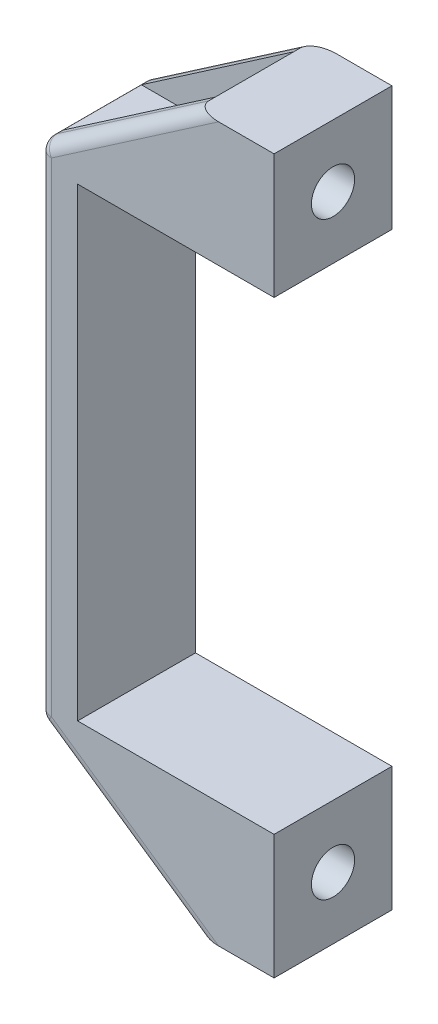
ISO-10303-21;
HEADER;
FILE_DESCRIPTION(('STEP AP214'),'2;1');
FILE_NAME('part.step','',(''),(''),'','','');
FILE_SCHEMA(('AUTOMOTIVE_DESIGN { 1 0 10303 214 1 1 1 1 }'));
ENDSEC;
DATA;
#1=APPLICATION_CONTEXT('core data for automotive mechanical design processes');
#2=APPLICATION_PROTOCOL_DEFINITION('international standard','automotive_design',2000,#1);
#3=PRODUCT_CONTEXT('',#1,'mechanical');
#4=PRODUCT('Part','Part','',(#3));
#5=PRODUCT_RELATED_PRODUCT_CATEGORY('part','',(#4));
#6=PRODUCT_DEFINITION_FORMATION('','',#4);
#7=PRODUCT_DEFINITION_CONTEXT('part definition',#1,'design');
#8=PRODUCT_DEFINITION('design','',#6,#7);
#9=PRODUCT_DEFINITION_SHAPE('','',#8);
#10=(LENGTH_UNIT() NAMED_UNIT(*) SI_UNIT(.MILLI.,.METRE.));
#11=(NAMED_UNIT(*) PLANE_ANGLE_UNIT() SI_UNIT($,.RADIAN.));
#12=(NAMED_UNIT(*) SI_UNIT($,.STERADIAN.) SOLID_ANGLE_UNIT());
#13=UNCERTAINTY_MEASURE_WITH_UNIT(LENGTH_MEASURE(1.E-05),#10,'distance_accuracy_value','');
#14=(GEOMETRIC_REPRESENTATION_CONTEXT(3) GLOBAL_UNCERTAINTY_ASSIGNED_CONTEXT((#13)) GLOBAL_UNIT_ASSIGNED_CONTEXT((#10,
#11,#12)) REPRESENTATION_CONTEXT('',''));
#15=CARTESIAN_POINT('',(0.,0.,0.));
#16=DIRECTION('',(0.,0.,1.));
#17=DIRECTION('',(1.,0.,0.));
#18=AXIS2_PLACEMENT_3D('',#15,#16,#17);
#19=CARTESIAN_POINT('',(-12.,0.,9.));
#20=DIRECTION('',(0.566528822887066,0.824041924199367,0.));
#21=DIRECTION('',(-0.824041924199367,0.566528822887066,0.));
#22=AXIS2_PLACEMENT_3D('',#19,#20,#21);
#23=PLANE('',#22);
#24=DIRECTION('',(0.824041924199367,-0.566528822887066,0.));
#25=VECTOR('',#24,1.);
#26=CARTESIAN_POINT('',(-12.,0.,7.));
#27=LINE('',#26,#25);
#28=CARTESIAN_POINT('',(-12.,0.,7.));
#29=VERTEX_POINT('',#28);
#30=CARTESIAN_POINT('',(-35.1330576457741,15.9039771314697,7.));
#31=VERTEX_POINT('',#30);
#32=EDGE_CURVE('E278',#29,#31,#27,.F.);
#33=ORIENTED_EDGE('',*,*,#32,.T.);
#34=DIRECTION('',(0.,0.,-1.));
#35=VECTOR('',#34,1.);
#36=CARTESIAN_POINT('',(-35.1330576457741,15.9039771314697,9.));
#37=LINE('',#36,#35);
#38=CARTESIAN_POINT('',(-35.1330576457741,15.9039771314697,6.));
#39=VERTEX_POINT('',#38);
#40=EDGE_CURVE('E225',#31,#39,#37,.T.);
#41=ORIENTED_EDGE('',*,*,#40,.T.);
#42=DIRECTION('',(-0.824041924199367,0.566528822887066,0.));
#43=VECTOR('',#42,1.);
#44=CARTESIAN_POINT('',(-12.,0.,6.));
#45=LINE('',#44,#43);
#46=CARTESIAN_POINT('',(-12.,0.,6.));
#47=VERTEX_POINT('',#46);
#48=EDGE_CURVE('E213',#47,#39,#45,.T.);
#49=ORIENTED_EDGE('',*,*,#48,.F.);
#50=DIRECTION('',(0.,0.,-1.));
#51=VECTOR('',#50,1.);
#52=CARTESIAN_POINT('',(-12.,0.,9.));
#53=LINE('',#52,#51);
#54=EDGE_CURVE('E196',#29,#47,#53,.T.);
#55=ORIENTED_EDGE('',*,*,#54,.F.);
#56=EDGE_LOOP('',(#33,#41,#49,#55));
#57=FACE_BOUND('',#56,.T.);
#58=ADVANCED_FACE('F31',(#57),#23,.F.);
#59=CARTESIAN_POINT('',(-36.,92.5,9.));
#60=DIRECTION('',(0.566528822887066,-0.824041924199367,0.));
#61=DIRECTION('',(0.824041924199367,0.566528822887066,0.));
#62=AXIS2_PLACEMENT_3D('',#59,#60,#61);
#63=PLANE('',#62);
#64=DIRECTION('',(0.,0.,-1.));
#65=VECTOR('',#64,1.);
#66=CARTESIAN_POINT('',(-12.,109.,9.));
#67=LINE('',#66,#65);
#68=CARTESIAN_POINT('',(-12.,109.,-6.));
#69=VERTEX_POINT('',#68);
#70=CARTESIAN_POINT('',(-12.,109.,-7.));
#71=VERTEX_POINT('',#70);
#72=EDGE_CURVE('E207',#69,#71,#67,.T.);
#73=ORIENTED_EDGE('',*,*,#72,.T.);
#74=DIRECTION('',(-0.824041924199367,-0.566528822887066,0.));
#75=VECTOR('',#74,1.);
#76=CARTESIAN_POINT('',(-36.,92.5,-7.));
#77=LINE('',#76,#75);
#78=CARTESIAN_POINT('',(-35.1330576457741,93.0960228685303,-7.));
#79=VERTEX_POINT('',#78);
#80=EDGE_CURVE('E240',#71,#79,#77,.T.);
#81=ORIENTED_EDGE('',*,*,#80,.T.);
#82=DIRECTION('',(0.,0.,-1.));
#83=VECTOR('',#82,1.);
#84=CARTESIAN_POINT('',(-35.1330576457741,93.0960228685303,9.));
#85=LINE('',#84,#83);
#86=CARTESIAN_POINT('',(-35.1330576457741,93.0960228685303,-6.));
#87=VERTEX_POINT('',#86);
#88=EDGE_CURVE('E238',#79,#87,#85,.F.);
#89=ORIENTED_EDGE('',*,*,#88,.T.);
#90=DIRECTION('',(0.824041924199367,0.566528822887066,0.));
#91=VECTOR('',#90,1.);
#92=CARTESIAN_POINT('',(-36.,92.5,-6.));
#93=LINE('',#92,#91);
#94=EDGE_CURVE('E227',#87,#69,#93,.T.);
#95=ORIENTED_EDGE('',*,*,#94,.T.);
#96=EDGE_LOOP('',(#73,#81,#89,#95));
#97=FACE_BOUND('',#96,.T.);
#98=ADVANCED_FACE('F467',(#97),#63,.F.);
#99=DIRECTION('',(0.824041924199367,-0.566528822887066,0.));
#100=VECTOR('',#99,1.);
#101=CARTESIAN_POINT('',(-12.,0.,-6.));
#102=LINE('',#101,#100);
#103=CARTESIAN_POINT('',(-35.1330576457741,15.9039771314697,-6.));
#104=VERTEX_POINT('',#103);
#105=CARTESIAN_POINT('',(-12.,0.,-6.));
#106=VERTEX_POINT('',#105);
#107=EDGE_CURVE('E226',#104,#106,#102,.T.);
#108=ORIENTED_EDGE('',*,*,#107,.F.);
#109=DIRECTION('',(0.,0.,-1.));
#110=VECTOR('',#109,1.);
#111=CARTESIAN_POINT('',(-35.1330576457741,15.9039771314697,9.));
#112=LINE('',#111,#110);
#113=CARTESIAN_POINT('',(-35.1330576457741,15.9039771314697,-7.));
#114=VERTEX_POINT('',#113);
#115=EDGE_CURVE('E276',#104,#114,#112,.T.);
#116=ORIENTED_EDGE('',*,*,#115,.T.);
#117=DIRECTION('',(0.824041924199367,-0.566528822887066,0.));
#118=VECTOR('',#117,1.);
#119=CARTESIAN_POINT('',(-12.,0.,-7.));
#120=LINE('',#119,#118);
#121=CARTESIAN_POINT('',(-12.,0.,-7.));
#122=VERTEX_POINT('',#121);
#123=EDGE_CURVE('E274',#114,#122,#120,.T.);
#124=ORIENTED_EDGE('',*,*,#123,.T.);
#125=EDGE_CURVE('E208',#106,#122,#53,.T.);
#126=ORIENTED_EDGE('',*,*,#125,.F.);
#127=EDGE_LOOP('',(#108,#116,#124,#126));
#128=FACE_BOUND('',#127,.T.);
#129=ADVANCED_FACE('F500',(#128),#23,.F.);
#130=CARTESIAN_POINT('',(0.,19.,9.));
#131=DIRECTION('',(-1.,0.,0.));
#132=DIRECTION('',(0.,-1.,0.));
#133=AXIS2_PLACEMENT_3D('',#130,#131,#132);
#134=PLANE('',#133);
#135=CARTESIAN_POINT('',(0.,9.49999999999999,0.));
#136=DIRECTION('',(-1.,0.,0.));
#137=DIRECTION('',(0.,0.,1.));
#138=AXIS2_PLACEMENT_3D('',#135,#136,#137);
#139=CIRCLE('',#138,3.3);
#140=CARTESIAN_POINT('',(0.,9.49999999999999,3.3));
#141=VERTEX_POINT('',#140);
#142=EDGE_CURVE('E335',#141,#141,#139,.T.);
#143=ORIENTED_EDGE('',*,*,#142,.T.);
#144=EDGE_LOOP('',(#143));
#145=FACE_BOUND('',#144,.T.);
#146=DIRECTION('',(0.,1.,0.));
#147=VECTOR('',#146,1.);
#148=CARTESIAN_POINT('',(0.,19.,-9.));
#149=LINE('',#148,#147);
#150=CARTESIAN_POINT('',(0.,0.,-9.));
#151=VERTEX_POINT('',#150);
#152=CARTESIAN_POINT('',(0.,19.,-9.));
#153=VERTEX_POINT('',#152);
#154=EDGE_CURVE('E371',#151,#153,#149,.T.);
#155=ORIENTED_EDGE('',*,*,#154,.T.);
#156=DIRECTION('',(0.,0.,-1.));
#157=VECTOR('',#156,1.);
#158=CARTESIAN_POINT('',(0.,19.,9.));
#159=LINE('',#158,#157);
#160=CARTESIAN_POINT('',(0.,19.,9.));
#161=VERTEX_POINT('',#160);
#162=EDGE_CURVE('E422',#161,#153,#159,.T.);
#163=ORIENTED_EDGE('',*,*,#162,.F.);
#164=DIRECTION('',(0.,1.,0.));
#165=VECTOR('',#164,1.);
#166=CARTESIAN_POINT('',(0.,19.,9.));
#167=LINE('',#166,#165);
#168=CARTESIAN_POINT('',(0.,0.,9.));
#169=VERTEX_POINT('',#168);
#170=EDGE_CURVE('E374',#169,#161,#167,.T.);
#171=ORIENTED_EDGE('',*,*,#170,.F.);
#172=DIRECTION('',(0.,0.,-1.));
#173=VECTOR('',#172,1.);
#174=CARTESIAN_POINT('',(0.,0.,9.));
#175=LINE('',#174,#173);
#176=EDGE_CURVE('E391',#169,#151,#175,.T.);
#177=ORIENTED_EDGE('',*,*,#176,.T.);
#178=EDGE_LOOP('',(#155,#163,#171,#177));
#179=FACE_BOUND('',#178,.T.);
#180=ADVANCED_FACE('F514',(#145,#179),#134,.F.);
#181=CARTESIAN_POINT('',(-30.,19.,9.));
#182=DIRECTION('',(0.,-1.,0.));
#183=DIRECTION('',(0.,0.,-1.));
#184=AXIS2_PLACEMENT_3D('',#181,#182,#183);
#185=PLANE('',#184);
#186=DIRECTION('',(-1.,0.,0.));
#187=VECTOR('',#186,1.);
#188=CARTESIAN_POINT('',(-30.,19.,-9.));
#189=LINE('',#188,#187);
#190=CARTESIAN_POINT('',(-30.,19.,-9.));
#191=VERTEX_POINT('',#190);
#192=EDGE_CURVE('E394',#153,#191,#189,.T.);
#193=ORIENTED_EDGE('',*,*,#192,.T.);
#194=DIRECTION('',(0.,0.,-1.));
#195=VECTOR('',#194,1.);
#196=CARTESIAN_POINT('',(-30.,19.,9.));
#197=LINE('',#196,#195);
#198=CARTESIAN_POINT('',(-30.,19.,9.));
#199=VERTEX_POINT('',#198);
#200=EDGE_CURVE('E419',#199,#191,#197,.T.);
#201=ORIENTED_EDGE('',*,*,#200,.F.);
#202=DIRECTION('',(-1.,0.,0.));
#203=VECTOR('',#202,1.);
#204=CARTESIAN_POINT('',(-30.,19.,9.));
#205=LINE('',#204,#203);
#206=EDGE_CURVE('E377',#161,#199,#205,.T.);
#207=ORIENTED_EDGE('',*,*,#206,.F.);
#208=ORIENTED_EDGE('',*,*,#162,.T.);
#209=EDGE_LOOP('',(#193,#201,#207,#208));
#210=FACE_BOUND('',#209,.T.);
#211=ADVANCED_FACE('F520',(#210),#185,.F.);
#212=CARTESIAN_POINT('',(-30.,90.,9.));
#213=DIRECTION('',(-1.,0.,0.));
#214=DIRECTION('',(0.,0.,1.));
#215=AXIS2_PLACEMENT_3D('',#212,#213,#214);
#216=PLANE('',#215);
#217=DIRECTION('',(0.,1.,0.));
#218=VECTOR('',#217,1.);
#219=CARTESIAN_POINT('',(-30.,90.,-9.));
#220=LINE('',#219,#218);
#221=CARTESIAN_POINT('',(-30.,90.,-9.));
#222=VERTEX_POINT('',#221);
#223=EDGE_CURVE('E396',#191,#222,#220,.T.);
#224=ORIENTED_EDGE('',*,*,#223,.T.);
#225=DIRECTION('',(0.,0.,-1.));
#226=VECTOR('',#225,1.);
#227=CARTESIAN_POINT('',(-30.,90.,9.));
#228=LINE('',#227,#226);
#229=CARTESIAN_POINT('',(-30.,90.,9.));
#230=VERTEX_POINT('',#229);
#231=EDGE_CURVE('E416',#230,#222,#228,.T.);
#232=ORIENTED_EDGE('',*,*,#231,.F.);
#233=DIRECTION('',(0.,1.,0.));
#234=VECTOR('',#233,1.);
#235=CARTESIAN_POINT('',(-30.,90.,9.));
#236=LINE('',#235,#234);
#237=EDGE_CURVE('E380',#199,#230,#236,.T.);
#238=ORIENTED_EDGE('',*,*,#237,.F.);
#239=ORIENTED_EDGE('',*,*,#200,.T.);
#240=EDGE_LOOP('',(#224,#232,#238,#239));
#241=FACE_BOUND('',#240,.T.);
#242=ADVANCED_FACE('F523',(#241),#216,.F.);
#243=CARTESIAN_POINT('',(0.,90.,9.));
#244=DIRECTION('',(0.,1.,0.));
#245=DIRECTION('',(0.,0.,1.));
#246=AXIS2_PLACEMENT_3D('',#243,#244,#245);
#247=PLANE('',#246);
#248=DIRECTION('',(1.,0.,0.));
#249=VECTOR('',#248,1.);
#250=CARTESIAN_POINT('',(0.,90.,-9.));
#251=LINE('',#250,#249);
#252=CARTESIAN_POINT('',(0.,90.,-9.));
#253=VERTEX_POINT('',#252);
#254=EDGE_CURVE('E398',#222,#253,#251,.T.);
#255=ORIENTED_EDGE('',*,*,#254,.T.);
#256=DIRECTION('',(0.,0.,-1.));
#257=VECTOR('',#256,1.);
#258=CARTESIAN_POINT('',(0.,90.,9.));
#259=LINE('',#258,#257);
#260=CARTESIAN_POINT('',(0.,90.,9.));
#261=VERTEX_POINT('',#260);
#262=EDGE_CURVE('E413',#261,#253,#259,.T.);
#263=ORIENTED_EDGE('',*,*,#262,.F.);
#264=DIRECTION('',(1.,0.,0.));
#265=VECTOR('',#264,1.);
#266=CARTESIAN_POINT('',(0.,90.,9.));
#267=LINE('',#266,#265);
#268=EDGE_CURVE('E382',#230,#261,#267,.T.);
#269=ORIENTED_EDGE('',*,*,#268,.F.);
#270=ORIENTED_EDGE('',*,*,#231,.T.);
#271=EDGE_LOOP('',(#255,#263,#269,#270));
#272=FACE_BOUND('',#271,.T.);
#273=ADVANCED_FACE('F528',(#272),#247,.F.);
#274=CARTESIAN_POINT('',(0.,109.,9.));
#275=DIRECTION('',(-1.,0.,0.));
#276=DIRECTION('',(0.,-1.,0.));
#277=AXIS2_PLACEMENT_3D('',#274,#275,#276);
#278=PLANE('',#277);
#279=CARTESIAN_POINT('',(0.,99.5,0.));
#280=DIRECTION('',(-1.,0.,0.));
#281=DIRECTION('',(0.,0.,1.));
#282=AXIS2_PLACEMENT_3D('',#279,#280,#281);
#283=CIRCLE('',#282,3.3);
#284=CARTESIAN_POINT('',(0.,99.5,3.3));
#285=VERTEX_POINT('',#284);
#286=EDGE_CURVE('E352',#285,#285,#283,.T.);
#287=ORIENTED_EDGE('',*,*,#286,.T.);
#288=EDGE_LOOP('',(#287));
#289=FACE_BOUND('',#288,.T.);
#290=DIRECTION('',(0.,1.,0.));
#291=VECTOR('',#290,1.);
#292=CARTESIAN_POINT('',(0.,109.,-9.));
#293=LINE('',#292,#291);
#294=CARTESIAN_POINT('',(0.,109.,-9.));
#295=VERTEX_POINT('',#294);
#296=EDGE_CURVE('E400',#253,#295,#293,.T.);
#297=ORIENTED_EDGE('',*,*,#296,.T.);
#298=DIRECTION('',(0.,0.,-1.));
#299=VECTOR('',#298,1.);
#300=CARTESIAN_POINT('',(0.,109.,9.));
#301=LINE('',#300,#299);
#302=CARTESIAN_POINT('',(0.,109.,9.));
#303=VERTEX_POINT('',#302);
#304=EDGE_CURVE('E410',#303,#295,#301,.T.);
#305=ORIENTED_EDGE('',*,*,#304,.F.);
#306=DIRECTION('',(0.,1.,0.));
#307=VECTOR('',#306,1.);
#308=CARTESIAN_POINT('',(0.,109.,9.));
#309=LINE('',#308,#307);
#310=EDGE_CURVE('E384',#261,#303,#309,.T.);
#311=ORIENTED_EDGE('',*,*,#310,.F.);
#312=ORIENTED_EDGE('',*,*,#262,.T.);
#313=EDGE_LOOP('',(#297,#305,#311,#312));
#314=FACE_BOUND('',#313,.T.);
#315=ADVANCED_FACE('F532',(#289,#314),#278,.F.);
#316=CARTESIAN_POINT('',(-12.,109.,9.));
#317=DIRECTION('',(0.,-1.,0.));
#318=DIRECTION('',(0.,0.,-1.));
#319=AXIS2_PLACEMENT_3D('',#316,#317,#318);
#320=PLANE('',#319);
#321=DIRECTION('',(-1.,0.,0.));
#322=VECTOR('',#321,1.);
#323=CARTESIAN_POINT('',(-12.,109.,-9.));
#324=LINE('',#323,#322);
#325=CARTESIAN_POINT('',(-8.46972948382771,109.,-9.));
#326=VERTEX_POINT('',#325);
#327=EDGE_CURVE('E402',#295,#326,#324,.T.);
#328=ORIENTED_EDGE('',*,*,#327,.T.);
#329=CARTESIAN_POINT('',(-8.46972948382771,109.,-7.));
#330=DIRECTION('',(0.,-1.,0.));
#331=DIRECTION('',(1.,0.,0.));
#332=AXIS2_PLACEMENT_3D('',#329,#330,#331);
#333=ELLIPSE('',#332,3.53027051617229,2.);
#334=EDGE_CURVE('E251',#326,#71,#333,.F.);
#335=ORIENTED_EDGE('',*,*,#334,.T.);
#336=ORIENTED_EDGE('',*,*,#72,.F.);
#337=DIRECTION('',(0.,0.,-1.));
#338=VECTOR('',#337,1.);
#339=CARTESIAN_POINT('',(-12.,109.,-6.));
#340=LINE('',#339,#338);
#341=CARTESIAN_POINT('',(-12.,109.,6.));
#342=VERTEX_POINT('',#341);
#343=EDGE_CURVE('E364',#342,#69,#340,.T.);
#344=ORIENTED_EDGE('',*,*,#343,.F.);
#345=CARTESIAN_POINT('',(-12.,109.,7.));
#346=VERTEX_POINT('',#345);
#347=EDGE_CURVE('E408',#346,#342,#67,.T.);
#348=ORIENTED_EDGE('',*,*,#347,.F.);
#349=CARTESIAN_POINT('',(-8.46972948382772,109.,7.));
#350=DIRECTION('',(0.,-1.,0.));
#351=DIRECTION('',(-1.,0.,0.));
#352=AXIS2_PLACEMENT_3D('',#349,#350,#351);
#353=ELLIPSE('',#352,3.53027051617229,2.);
#354=CARTESIAN_POINT('',(-8.46972948382773,109.,9.));
#355=VERTEX_POINT('',#354);
#356=EDGE_CURVE('E249',#346,#355,#353,.F.);
#357=ORIENTED_EDGE('',*,*,#356,.T.);
#358=DIRECTION('',(-1.,0.,0.));
#359=VECTOR('',#358,1.);
#360=CARTESIAN_POINT('',(-12.,109.,9.));
#361=LINE('',#360,#359);
#362=EDGE_CURVE('E386',#303,#355,#361,.T.);
#363=ORIENTED_EDGE('',*,*,#362,.F.);
#364=ORIENTED_EDGE('',*,*,#304,.T.);
#365=EDGE_LOOP('',(#328,#335,#336,#344,#348,#357,#363,#364));
#366=FACE_BOUND('',#365,.T.);
#367=ADVANCED_FACE('F451',(#366),#320,.F.);
#368=DIRECTION('',(0.,0.,-1.));
#369=VECTOR('',#368,1.);
#370=CARTESIAN_POINT('',(-35.1330576457741,93.0960228685303,9.));
#371=LINE('',#370,#369);
#372=CARTESIAN_POINT('',(-35.1330576457741,93.0960228685303,6.));
#373=VERTEX_POINT('',#372);
#374=CARTESIAN_POINT('',(-35.1330576457741,93.0960228685303,7.));
#375=VERTEX_POINT('',#374);
#376=EDGE_CURVE('E229',#373,#375,#371,.F.);
#377=ORIENTED_EDGE('',*,*,#376,.T.);
#378=DIRECTION('',(-0.824041924199367,-0.566528822887066,0.));
#379=VECTOR('',#378,1.);
#380=CARTESIAN_POINT('',(-36.,92.5,7.));
#381=LINE('',#380,#379);
#382=EDGE_CURVE('E236',#375,#346,#381,.F.);
#383=ORIENTED_EDGE('',*,*,#382,.T.);
#384=ORIENTED_EDGE('',*,*,#347,.T.);
#385=DIRECTION('',(-0.824041924199367,-0.566528822887066,0.));
#386=VECTOR('',#385,1.);
#387=CARTESIAN_POINT('',(-36.,92.5,6.));
#388=LINE('',#387,#386);
#389=EDGE_CURVE('E231',#342,#373,#388,.T.);
#390=ORIENTED_EDGE('',*,*,#389,.T.);
#391=EDGE_LOOP('',(#377,#383,#384,#390));
#392=FACE_BOUND('',#391,.T.);
#393=ADVANCED_FACE('F428',(#392),#63,.F.);
#394=CARTESIAN_POINT('',(-36.,16.5,9.));
#395=DIRECTION('',(1.,0.,0.));
#396=DIRECTION('',(0.,0.,-1.));
#397=AXIS2_PLACEMENT_3D('',#394,#395,#396);
#398=PLANE('',#397);
#399=DIRECTION('',(0.,0.,-1.));
#400=VECTOR('',#399,1.);
#401=CARTESIAN_POINT('',(-36.,91.4479390201316,9.));
#402=LINE('',#401,#400);
#403=CARTESIAN_POINT('',(-36.,91.4479390201316,7.));
#404=VERTEX_POINT('',#403);
#405=CARTESIAN_POINT('',(-36.,91.4479390201316,-7.));
#406=VERTEX_POINT('',#405);
#407=EDGE_CURVE('E263',#404,#406,#402,.T.);
#408=ORIENTED_EDGE('',*,*,#407,.T.);
#409=DIRECTION('',(0.,-1.,0.));
#410=VECTOR('',#409,1.);
#411=CARTESIAN_POINT('',(-36.,16.5,-7.));
#412=LINE('',#411,#410);
#413=CARTESIAN_POINT('',(-36.,17.5520609798685,-7.));
#414=VERTEX_POINT('',#413);
#415=EDGE_CURVE('E266',#406,#414,#412,.T.);
#416=ORIENTED_EDGE('',*,*,#415,.T.);
#417=DIRECTION('',(0.,0.,-1.));
#418=VECTOR('',#417,1.);
#419=CARTESIAN_POINT('',(-36.,17.5520609798685,9.));
#420=LINE('',#419,#418);
#421=CARTESIAN_POINT('',(-36.,17.5520609798685,7.));
#422=VERTEX_POINT('',#421);
#423=EDGE_CURVE('E261',#414,#422,#420,.F.);
#424=ORIENTED_EDGE('',*,*,#423,.T.);
#425=DIRECTION('',(0.,-1.,0.));
#426=VECTOR('',#425,1.);
#427=CARTESIAN_POINT('',(-36.,16.5,7.));
#428=LINE('',#427,#426);
#429=EDGE_CURVE('E259',#422,#404,#428,.F.);
#430=ORIENTED_EDGE('',*,*,#429,.T.);
#431=EDGE_LOOP('',(#408,#416,#424,#430));
#432=FACE_BOUND('',#431,.T.);
#433=ADVANCED_FACE('F484',(#432),#398,.F.);
#434=CARTESIAN_POINT('',(0.,0.,9.));
#435=DIRECTION('',(0.,1.,0.));
#436=DIRECTION('',(0.,0.,1.));
#437=AXIS2_PLACEMENT_3D('',#434,#435,#436);
#438=PLANE('',#437);
#439=DIRECTION('',(1.,0.,0.));
#440=VECTOR('',#439,1.);
#441=CARTESIAN_POINT('',(0.,0.,9.));
#442=LINE('',#441,#440);
#443=CARTESIAN_POINT('',(-8.46972948382771,0.,9.));
#444=VERTEX_POINT('',#443);
#445=EDGE_CURVE('E389',#444,#169,#442,.T.);
#446=ORIENTED_EDGE('',*,*,#445,.F.);
#447=CARTESIAN_POINT('',(-8.46972948382771,0.,7.));
#448=DIRECTION('',(0.,1.,0.));
#449=DIRECTION('',(1.,0.,0.));
#450=AXIS2_PLACEMENT_3D('',#447,#448,#449);
#451=ELLIPSE('',#450,3.53027051617229,2.);
#452=EDGE_CURVE('E11',#444,#29,#451,.F.);
#453=ORIENTED_EDGE('',*,*,#452,.T.);
#454=ORIENTED_EDGE('',*,*,#54,.T.);
#455=DIRECTION('',(0.,0.,-1.));
#456=VECTOR('',#455,1.);
#457=CARTESIAN_POINT('',(-12.,0.,-6.));
#458=LINE('',#457,#456);
#459=EDGE_CURVE('E202',#47,#106,#458,.T.);
#460=ORIENTED_EDGE('',*,*,#459,.T.);
#461=ORIENTED_EDGE('',*,*,#125,.T.);
#462=CARTESIAN_POINT('',(-8.46972948382771,0.,-7.));
#463=DIRECTION('',(0.,1.,0.));
#464=DIRECTION('',(-1.,0.,0.));
#465=AXIS2_PLACEMENT_3D('',#462,#463,#464);
#466=ELLIPSE('',#465,3.53027051617229,2.);
#467=CARTESIAN_POINT('',(-8.46972948382771,0.,-9.));
#468=VERTEX_POINT('',#467);
#469=EDGE_CURVE('E40',#122,#468,#466,.F.);
#470=ORIENTED_EDGE('',*,*,#469,.T.);
#471=DIRECTION('',(1.,0.,0.));
#472=VECTOR('',#471,1.);
#473=CARTESIAN_POINT('',(0.,0.,-9.));
#474=LINE('',#473,#472);
#475=EDGE_CURVE('E378',#468,#151,#474,.T.);
#476=ORIENTED_EDGE('',*,*,#475,.T.);
#477=ORIENTED_EDGE('',*,*,#176,.F.);
#478=EDGE_LOOP('',(#446,#453,#454,#460,#461,#470,#476,#477));
#479=FACE_BOUND('',#478,.T.);
#480=ADVANCED_FACE('F199',(#479),#438,.F.);
#481=CARTESIAN_POINT('',(0.,0.,9.));
#482=DIRECTION('',(0.,0.,-1.));
#483=DIRECTION('',(-1.,0.,0.));
#484=AXIS2_PLACEMENT_3D('',#481,#482,#483);
#485=PLANE('',#484);
#486=ORIENTED_EDGE('',*,*,#362,.T.);
#487=DIRECTION('',(-0.824041924199367,-0.566528822887066,0.));
#488=VECTOR('',#487,1.);
#489=CARTESIAN_POINT('',(-53.6043428847299,77.9699532868798,9.));
#490=LINE('',#489,#488);
#491=CARTESIAN_POINT('',(-34.,91.4479390201316,9.));
#492=VERTEX_POINT('',#491);
#493=EDGE_CURVE('E257',#355,#492,#490,.T.);
#494=ORIENTED_EDGE('',*,*,#493,.T.);
#495=DIRECTION('',(0.,-1.,0.));
#496=VECTOR('',#495,1.);
#497=CARTESIAN_POINT('',(-34.,0.,9.));
#498=LINE('',#497,#496);
#499=CARTESIAN_POINT('',(-34.,17.5520609798684,9.));
#500=VERTEX_POINT('',#499);
#501=EDGE_CURVE('E253',#492,#500,#498,.T.);
#502=ORIENTED_EDGE('',*,*,#501,.T.);
#503=DIRECTION('',(0.824041924199367,-0.566528822887066,0.));
#504=VECTOR('',#503,1.);
#505=CARTESIAN_POINT('',(-2.71840124016752,-3.95403816751639,9.));
#506=LINE('',#505,#504);
#507=EDGE_CURVE('E255',#500,#444,#506,.T.);
#508=ORIENTED_EDGE('',*,*,#507,.T.);
#509=ORIENTED_EDGE('',*,*,#445,.T.);
#510=ORIENTED_EDGE('',*,*,#170,.T.);
#511=ORIENTED_EDGE('',*,*,#206,.T.);
#512=ORIENTED_EDGE('',*,*,#237,.T.);
#513=ORIENTED_EDGE('',*,*,#268,.T.);
#514=ORIENTED_EDGE('',*,*,#310,.T.);
#515=EDGE_LOOP('',(#486,#494,#502,#508,#509,#510,#511,#512,#513,#514));
#516=FACE_BOUND('',#515,.T.);
#517=ADVANCED_FACE('F488',(#516),#485,.F.);
#518=CARTESIAN_POINT('',(0.,0.,-9.));
#519=DIRECTION('',(0.,0.,-1.));
#520=DIRECTION('',(-1.,0.,0.));
#521=AXIS2_PLACEMENT_3D('',#518,#519,#520);
#522=PLANE('',#521);
#523=DIRECTION('',(0.,-1.,0.));
#524=VECTOR('',#523,1.);
#525=CARTESIAN_POINT('',(-34.,92.5,-9.));
#526=LINE('',#525,#524);
#527=CARTESIAN_POINT('',(-34.,17.5520609798685,-9.));
#528=VERTEX_POINT('',#527);
#529=CARTESIAN_POINT('',(-34.,91.4479390201316,-9.));
#530=VERTEX_POINT('',#529);
#531=EDGE_CURVE('E243',#528,#530,#526,.F.);
#532=ORIENTED_EDGE('',*,*,#531,.T.);
#533=DIRECTION('',(-0.824041924199367,-0.566528822887066,0.));
#534=VECTOR('',#533,1.);
#535=CARTESIAN_POINT('',(-10.8669423542259,107.351916151601,-9.));
#536=LINE('',#535,#534);
#537=EDGE_CURVE('E247',#530,#326,#536,.F.);
#538=ORIENTED_EDGE('',*,*,#537,.T.);
#539=ORIENTED_EDGE('',*,*,#327,.F.);
#540=ORIENTED_EDGE('',*,*,#296,.F.);
#541=ORIENTED_EDGE('',*,*,#254,.F.);
#542=ORIENTED_EDGE('',*,*,#223,.F.);
#543=ORIENTED_EDGE('',*,*,#192,.F.);
#544=ORIENTED_EDGE('',*,*,#154,.F.);
#545=ORIENTED_EDGE('',*,*,#475,.F.);
#546=DIRECTION('',(0.824041924199367,-0.566528822887066,0.));
#547=VECTOR('',#546,1.);
#548=CARTESIAN_POINT('',(-34.8669423542258,18.1480838483987,-9.));
#549=LINE('',#548,#547);
#550=EDGE_CURVE('E245',#468,#528,#549,.F.);
#551=ORIENTED_EDGE('',*,*,#550,.T.);
#552=EDGE_LOOP('',(#532,#538,#539,#540,#541,#542,#543,#544,#545,#551));
#553=FACE_BOUND('',#552,.T.);
#554=ADVANCED_FACE('F509',(#553),#522,.T.);
#555=CARTESIAN_POINT('',(-12.,93.,-6.));
#556=DIRECTION('',(0.,0.,-1.));
#557=DIRECTION('',(-1.,0.,0.));
#558=AXIS2_PLACEMENT_3D('',#555,#556,#557);
#559=PLANE('',#558);
#560=ORIENTED_EDGE('',*,*,#94,.F.);
#561=CARTESIAN_POINT('',(-34.,91.4479390201316,-6.));
#562=DIRECTION('',(0.,0.,-1.));
#563=DIRECTION('',(-1.,0.,0.));
#564=AXIS2_PLACEMENT_3D('',#561,#562,#563);
#565=CIRCLE('',#564,2.);
#566=CARTESIAN_POINT('',(-35.2613907859065,93.,-6.));
#567=VERTEX_POINT('',#566);
#568=EDGE_CURVE('E268',#87,#567,#565,.F.);
#569=ORIENTED_EDGE('',*,*,#568,.T.);
#570=DIRECTION('',(-1.,0.,0.));
#571=VECTOR('',#570,1.);
#572=CARTESIAN_POINT('',(-12.,93.,-6.));
#573=LINE('',#572,#571);
#574=CARTESIAN_POINT('',(-12.,93.,-6.));
#575=VERTEX_POINT('',#574);
#576=EDGE_CURVE('E367',#575,#567,#573,.T.);
#577=ORIENTED_EDGE('',*,*,#576,.F.);
#578=DIRECTION('',(0.,-1.,0.));
#579=VECTOR('',#578,1.);
#580=CARTESIAN_POINT('',(-12.,93.,-6.));
#581=LINE('',#580,#579);
#582=EDGE_CURVE('E355',#69,#575,#581,.T.);
#583=ORIENTED_EDGE('',*,*,#582,.F.);
#584=EDGE_LOOP('',(#560,#569,#577,#583));
#585=FACE_BOUND('',#584,.T.);
#586=ADVANCED_FACE('F465',(#585),#559,.F.);
#587=CARTESIAN_POINT('',(-12.,93.,6.));
#588=DIRECTION('',(0.,0.,1.));
#589=DIRECTION('',(1.,0.,0.));
#590=AXIS2_PLACEMENT_3D('',#587,#588,#589);
#591=PLANE('',#590);
#592=DIRECTION('',(-1.,0.,0.));
#593=VECTOR('',#592,1.);
#594=CARTESIAN_POINT('',(-12.,93.,6.));
#595=LINE('',#594,#593);
#596=CARTESIAN_POINT('',(-12.,93.,6.));
#597=VERTEX_POINT('',#596);
#598=CARTESIAN_POINT('',(-35.2613907859065,93.,6.));
#599=VERTEX_POINT('',#598);
#600=EDGE_CURVE('E368',#597,#599,#595,.T.);
#601=ORIENTED_EDGE('',*,*,#600,.T.);
#602=CARTESIAN_POINT('',(-34.,91.4479390201316,6.));
#603=DIRECTION('',(0.,0.,1.));
#604=DIRECTION('',(1.,0.,0.));
#605=AXIS2_PLACEMENT_3D('',#602,#603,#604);
#606=CIRCLE('',#605,2.);
#607=EDGE_CURVE('E272',#599,#373,#606,.F.);
#608=ORIENTED_EDGE('',*,*,#607,.T.);
#609=ORIENTED_EDGE('',*,*,#389,.F.);
#610=DIRECTION('',(0.,1.,0.));
#611=VECTOR('',#610,1.);
#612=CARTESIAN_POINT('',(-12.,93.,6.));
#613=LINE('',#612,#611);
#614=EDGE_CURVE('E361',#597,#342,#613,.T.);
#615=ORIENTED_EDGE('',*,*,#614,.F.);
#616=EDGE_LOOP('',(#601,#608,#609,#615));
#617=FACE_BOUND('',#616,.T.);
#618=ADVANCED_FACE('F459',(#617),#591,.F.);
#619=CARTESIAN_POINT('',(-12.,93.,-6.));
#620=DIRECTION('',(0.,-1.,0.));
#621=DIRECTION('',(0.,0.,-1.));
#622=AXIS2_PLACEMENT_3D('',#619,#620,#621);
#623=PLANE('',#622);
#624=ORIENTED_EDGE('',*,*,#576,.T.);
#625=DIRECTION('',(0.,0.,-1.));
#626=VECTOR('',#625,1.);
#627=CARTESIAN_POINT('',(-35.2613907859065,93.,-6.));
#628=LINE('',#627,#626);
#629=EDGE_CURVE('E270',#567,#599,#628,.F.);
#630=ORIENTED_EDGE('',*,*,#629,.T.);
#631=ORIENTED_EDGE('',*,*,#600,.F.);
#632=DIRECTION('',(0.,0.,1.));
#633=VECTOR('',#632,1.);
#634=CARTESIAN_POINT('',(-12.,93.,-6.));
#635=LINE('',#634,#633);
#636=EDGE_CURVE('E358',#575,#597,#635,.T.);
#637=ORIENTED_EDGE('',*,*,#636,.F.);
#638=EDGE_LOOP('',(#624,#630,#631,#637));
#639=FACE_BOUND('',#638,.T.);
#640=ADVANCED_FACE('F461',(#639),#623,.F.);
#641=CARTESIAN_POINT('',(-12.,109.,-6.));
#642=DIRECTION('',(1.,0.,0.));
#643=DIRECTION('',(0.,0.,-1.));
#644=AXIS2_PLACEMENT_3D('',#641,#642,#643);
#645=PLANE('',#644);
#646=CARTESIAN_POINT('',(-12.,99.5,0.));
#647=DIRECTION('',(-1.,0.,0.));
#648=DIRECTION('',(0.,0.,1.));
#649=AXIS2_PLACEMENT_3D('',#646,#647,#648);
#650=CIRCLE('',#649,5.50000000000001);
#651=CARTESIAN_POINT('',(-12.,99.5,5.50000000000001));
#652=VERTEX_POINT('',#651);
#653=EDGE_CURVE('E342',#652,#652,#650,.T.);
#654=ORIENTED_EDGE('',*,*,#653,.F.);
#655=EDGE_LOOP('',(#654));
#656=FACE_BOUND('',#655,.T.);
#657=ORIENTED_EDGE('',*,*,#582,.T.);
#658=ORIENTED_EDGE('',*,*,#636,.T.);
#659=ORIENTED_EDGE('',*,*,#614,.T.);
#660=ORIENTED_EDGE('',*,*,#343,.T.);
#661=EDGE_LOOP('',(#657,#658,#659,#660));
#662=FACE_BOUND('',#661,.T.);
#663=ADVANCED_FACE('F456',(#656,#662),#645,.F.);
#664=CARTESIAN_POINT('',(-12.,99.5,0.));
#665=DIRECTION('',(-1.,0.,0.));
#666=DIRECTION('',(0.,0.,1.));
#667=AXIS2_PLACEMENT_3D('',#664,#665,#666);
#668=CYLINDRICAL_SURFACE('',#667,3.3);
#669=ORIENTED_EDGE('',*,*,#286,.F.);
#670=EDGE_LOOP('',(#669));
#671=FACE_BOUND('',#670,.T.);
#672=CARTESIAN_POINT('',(-7.29999999999998,99.5,0.));
#673=DIRECTION('',(-1.,0.,0.));
#674=DIRECTION('',(0.,0.,1.));
#675=AXIS2_PLACEMENT_3D('',#672,#673,#674);
#676=CIRCLE('',#675,3.3);
#677=CARTESIAN_POINT('',(-7.29999999999998,99.5,3.3));
#678=VERTEX_POINT('',#677);
#679=EDGE_CURVE('E349',#678,#678,#676,.T.);
#680=ORIENTED_EDGE('',*,*,#679,.T.);
#681=EDGE_LOOP('',(#680));
#682=FACE_BOUND('',#681,.T.);
#683=ADVANCED_FACE('F624',(#671,#682),#668,.F.);
#684=CARTESIAN_POINT('',(-7.29999999999998,102.8,0.));
#685=DIRECTION('',(1.,0.,0.));
#686=DIRECTION('',(0.,0.,-1.));
#687=AXIS2_PLACEMENT_3D('',#684,#685,#686);
#688=PLANE('',#687);
#689=ORIENTED_EDGE('',*,*,#679,.F.);
#690=EDGE_LOOP('',(#689));
#691=FACE_BOUND('',#690,.T.);
#692=CARTESIAN_POINT('',(-7.29999999999998,99.5,0.));
#693=DIRECTION('',(-1.,0.,0.));
#694=DIRECTION('',(0.,0.,1.));
#695=AXIS2_PLACEMENT_3D('',#692,#693,#694);
#696=CIRCLE('',#695,5.50000000000001);
#697=CARTESIAN_POINT('',(-7.29999999999998,99.5,5.50000000000001));
#698=VERTEX_POINT('',#697);
#699=EDGE_CURVE('E346',#698,#698,#696,.T.);
#700=ORIENTED_EDGE('',*,*,#699,.T.);
#701=EDGE_LOOP('',(#700));
#702=FACE_BOUND('',#701,.T.);
#703=ADVANCED_FACE('F620',(#691,#702),#688,.F.);
#704=CARTESIAN_POINT('',(-12.,99.5,0.));
#705=DIRECTION('',(-1.,0.,0.));
#706=DIRECTION('',(0.,0.,1.));
#707=AXIS2_PLACEMENT_3D('',#704,#705,#706);
#708=CYLINDRICAL_SURFACE('',#707,5.50000000000001);
#709=ORIENTED_EDGE('',*,*,#699,.F.);
#710=EDGE_LOOP('',(#709));
#711=FACE_BOUND('',#710,.T.);
#712=ORIENTED_EDGE('',*,*,#653,.T.);
#713=EDGE_LOOP('',(#712));
#714=FACE_BOUND('',#713,.T.);
#715=ADVANCED_FACE('F617',(#711,#714),#708,.F.);
#716=CARTESIAN_POINT('',(-12.,16.,-6.));
#717=DIRECTION('',(0.,0.,1.));
#718=DIRECTION('',(1.,0.,0.));
#719=AXIS2_PLACEMENT_3D('',#716,#717,#718);
#720=PLANE('',#719);
#721=DIRECTION('',(-1.,0.,0.));
#722=VECTOR('',#721,1.);
#723=CARTESIAN_POINT('',(-12.,16.,-6.));
#724=LINE('',#723,#722);
#725=CARTESIAN_POINT('',(-12.,16.,-6.));
#726=VERTEX_POINT('',#725);
#727=CARTESIAN_POINT('',(-35.2613907859065,16.,-6.));
#728=VERTEX_POINT('',#727);
#729=EDGE_CURVE('E340',#726,#728,#724,.T.);
#730=ORIENTED_EDGE('',*,*,#729,.T.);
#731=CARTESIAN_POINT('',(-34.,17.5520609798685,-6.));
#732=DIRECTION('',(0.,0.,1.));
#733=DIRECTION('',(1.,0.,0.));
#734=AXIS2_PLACEMENT_3D('',#731,#732,#733);
#735=CIRCLE('',#734,2.);
#736=EDGE_CURVE('E283',#728,#104,#735,.T.);
#737=ORIENTED_EDGE('',*,*,#736,.T.);
#738=ORIENTED_EDGE('',*,*,#107,.T.);
#739=DIRECTION('',(0.,1.,0.));
#740=VECTOR('',#739,1.);
#741=CARTESIAN_POINT('',(-12.,16.,-6.));
#742=LINE('',#741,#740);
#743=EDGE_CURVE('E221',#106,#726,#742,.T.);
#744=ORIENTED_EDGE('',*,*,#743,.T.);
#745=EDGE_LOOP('',(#730,#737,#738,#744));
#746=FACE_BOUND('',#745,.T.);
#747=ADVANCED_FACE('F498',(#746),#720,.T.);
#748=CARTESIAN_POINT('',(-12.,16.,-6.));
#749=DIRECTION('',(0.,-1.,0.));
#750=DIRECTION('',(0.,0.,-1.));
#751=AXIS2_PLACEMENT_3D('',#748,#749,#750);
#752=PLANE('',#751);
#753=DIRECTION('',(-1.,0.,0.));
#754=VECTOR('',#753,1.);
#755=CARTESIAN_POINT('',(-12.,16.,6.));
#756=LINE('',#755,#754);
#757=CARTESIAN_POINT('',(-12.,16.,6.));
#758=VERTEX_POINT('',#757);
#759=CARTESIAN_POINT('',(-35.2613907859065,16.,6.));
#760=VERTEX_POINT('',#759);
#761=EDGE_CURVE('E214',#758,#760,#756,.T.);
#762=ORIENTED_EDGE('',*,*,#761,.T.);
#763=DIRECTION('',(0.,0.,-1.));
#764=VECTOR('',#763,1.);
#765=CARTESIAN_POINT('',(-35.2613907859065,16.,6.));
#766=LINE('',#765,#764);
#767=EDGE_CURVE('E48',#760,#728,#766,.T.);
#768=ORIENTED_EDGE('',*,*,#767,.T.);
#769=ORIENTED_EDGE('',*,*,#729,.F.);
#770=DIRECTION('',(0.,0.,1.));
#771=VECTOR('',#770,1.);
#772=CARTESIAN_POINT('',(-12.,16.,-6.));
#773=LINE('',#772,#771);
#774=EDGE_CURVE('E216',#726,#758,#773,.T.);
#775=ORIENTED_EDGE('',*,*,#774,.T.);
#776=EDGE_LOOP('',(#762,#768,#769,#775));
#777=FACE_BOUND('',#776,.T.);
#778=ADVANCED_FACE('F610',(#777),#752,.T.);
#779=CARTESIAN_POINT('',(-12.,16.,6.));
#780=DIRECTION('',(0.,0.,-1.));
#781=DIRECTION('',(-1.,0.,0.));
#782=AXIS2_PLACEMENT_3D('',#779,#780,#781);
#783=PLANE('',#782);
#784=ORIENTED_EDGE('',*,*,#48,.T.);
#785=CARTESIAN_POINT('',(-34.,17.5520609798685,6.));
#786=DIRECTION('',(0.,0.,-1.));
#787=DIRECTION('',(-1.,0.,0.));
#788=AXIS2_PLACEMENT_3D('',#785,#786,#787);
#789=CIRCLE('',#788,2.);
#790=EDGE_CURVE('E56',#39,#760,#789,.T.);
#791=ORIENTED_EDGE('',*,*,#790,.T.);
#792=ORIENTED_EDGE('',*,*,#761,.F.);
#793=DIRECTION('',(0.,-1.,0.));
#794=VECTOR('',#793,1.);
#795=CARTESIAN_POINT('',(-12.,16.,6.));
#796=LINE('',#795,#794);
#797=EDGE_CURVE('E211',#758,#47,#796,.T.);
#798=ORIENTED_EDGE('',*,*,#797,.T.);
#799=EDGE_LOOP('',(#784,#791,#792,#798));
#800=FACE_BOUND('',#799,.T.);
#801=ADVANCED_FACE('F212',(#800),#783,.T.);
#802=CARTESIAN_POINT('',(-12.,0.,-6.));
#803=DIRECTION('',(1.,0.,0.));
#804=DIRECTION('',(0.,0.,-1.));
#805=AXIS2_PLACEMENT_3D('',#802,#803,#804);
#806=PLANE('',#805);
#807=CARTESIAN_POINT('',(-12.,9.49999999999999,0.));
#808=DIRECTION('',(-1.,0.,0.));
#809=DIRECTION('',(0.,0.,1.));
#810=AXIS2_PLACEMENT_3D('',#807,#808,#809);
#811=CIRCLE('',#810,5.5);
#812=CARTESIAN_POINT('',(-12.,9.49999999999999,5.5));
#813=VERTEX_POINT('',#812);
#814=EDGE_CURVE('E320',#813,#813,#811,.T.);
#815=ORIENTED_EDGE('',*,*,#814,.F.);
#816=EDGE_LOOP('',(#815));
#817=FACE_BOUND('',#816,.T.);
#818=ORIENTED_EDGE('',*,*,#743,.F.);
#819=ORIENTED_EDGE('',*,*,#459,.F.);
#820=ORIENTED_EDGE('',*,*,#797,.F.);
#821=ORIENTED_EDGE('',*,*,#774,.F.);
#822=EDGE_LOOP('',(#818,#819,#820,#821));
#823=FACE_BOUND('',#822,.T.);
#824=ADVANCED_FACE('F219',(#817,#823),#806,.F.);
#825=CARTESIAN_POINT('',(-12.,9.49999999999999,0.));
#826=DIRECTION('',(-1.,0.,0.));
#827=DIRECTION('',(0.,0.,1.));
#828=AXIS2_PLACEMENT_3D('',#825,#826,#827);
#829=CYLINDRICAL_SURFACE('',#828,3.3);
#830=ORIENTED_EDGE('',*,*,#142,.F.);
#831=EDGE_LOOP('',(#830));
#832=FACE_BOUND('',#831,.T.);
#833=CARTESIAN_POINT('',(-7.29999999999998,9.49999999999999,0.));
#834=DIRECTION('',(-1.,0.,0.));
#835=DIRECTION('',(0.,0.,1.));
#836=AXIS2_PLACEMENT_3D('',#833,#834,#835);
#837=CIRCLE('',#836,3.3);
#838=CARTESIAN_POINT('',(-7.29999999999998,9.49999999999999,3.3));
#839=VERTEX_POINT('',#838);
#840=EDGE_CURVE('E330',#839,#839,#837,.T.);
#841=ORIENTED_EDGE('',*,*,#840,.T.);
#842=EDGE_LOOP('',(#841));
#843=FACE_BOUND('',#842,.T.);
#844=ADVANCED_FACE('F599',(#832,#843),#829,.F.);
#845=CARTESIAN_POINT('',(-7.29999999999998,12.8,0.));
#846=DIRECTION('',(1.,0.,0.));
#847=DIRECTION('',(0.,0.,-1.));
#848=AXIS2_PLACEMENT_3D('',#845,#846,#847);
#849=PLANE('',#848);
#850=ORIENTED_EDGE('',*,*,#840,.F.);
#851=EDGE_LOOP('',(#850));
#852=FACE_BOUND('',#851,.T.);
#853=CARTESIAN_POINT('',(-7.29999999999998,9.49999999999999,0.));
#854=DIRECTION('',(-1.,0.,0.));
#855=DIRECTION('',(0.,0.,1.));
#856=AXIS2_PLACEMENT_3D('',#853,#854,#855);
#857=CIRCLE('',#856,5.5);
#858=CARTESIAN_POINT('',(-7.29999999999998,9.49999999999999,5.5));
#859=VERTEX_POINT('',#858);
#860=EDGE_CURVE('E325',#859,#859,#857,.T.);
#861=ORIENTED_EDGE('',*,*,#860,.T.);
#862=EDGE_LOOP('',(#861));
#863=FACE_BOUND('',#862,.T.);
#864=ADVANCED_FACE('F593',(#852,#863),#849,.F.);
#865=CARTESIAN_POINT('',(-12.,9.49999999999999,0.));
#866=DIRECTION('',(-1.,0.,0.));
#867=DIRECTION('',(0.,0.,1.));
#868=AXIS2_PLACEMENT_3D('',#865,#866,#867);
#869=CYLINDRICAL_SURFACE('',#868,5.5);
#870=ORIENTED_EDGE('',*,*,#860,.F.);
#871=EDGE_LOOP('',(#870));
#872=FACE_BOUND('',#871,.T.);
#873=ORIENTED_EDGE('',*,*,#814,.T.);
#874=EDGE_LOOP('',(#873));
#875=FACE_BOUND('',#874,.T.);
#876=ADVANCED_FACE('F589',(#872,#875),#869,.F.);
#877=CARTESIAN_POINT('',(-2.71840124016752,-3.95403816751639,7.));
#878=DIRECTION('',(0.824041924199367,-0.566528822887066,0.));
#879=DIRECTION('',(0.566528822887066,0.824041924199367,0.));
#880=AXIS2_PLACEMENT_3D('',#877,#878,#879);
#881=CYLINDRICAL_SURFACE('',#880,2.);
#882=CARTESIAN_POINT('',(-34.,17.5520609798685,7.));
#883=DIRECTION('',(-0.824041924199368,0.566528822887065,0.));
#884=DIRECTION('',(-0.566528822887065,-0.824041924199368,0.));
#885=AXIS2_PLACEMENT_3D('',#882,#883,#884);
#886=CIRCLE('',#885,2.);
#887=EDGE_CURVE('E35',#31,#500,#886,.T.);
#888=ORIENTED_EDGE('',*,*,#887,.F.);
#889=ORIENTED_EDGE('',*,*,#32,.F.);
#890=ORIENTED_EDGE('',*,*,#452,.F.);
#891=ORIENTED_EDGE('',*,*,#507,.F.);
#892=EDGE_LOOP('',(#888,#889,#890,#891));
#893=FACE_BOUND('',#892,.T.);
#894=ADVANCED_FACE('F33',(#893),#881,.T.);
#895=CARTESIAN_POINT('',(-34.,17.5520609798685,7.));
#896=DIRECTION('',(0.,0.,1.));
#897=DIRECTION('',(1.,0.,0.));
#898=AXIS2_PLACEMENT_3D('',#895,#896,#897);
#899=SPHERICAL_SURFACE('',#898,2.);
#900=CARTESIAN_POINT('',(-34.,17.5520609798685,7.));
#901=DIRECTION('',(0.,0.,1.));
#902=DIRECTION('',(1.,0.,0.));
#903=AXIS2_PLACEMENT_3D('',#900,#901,#902);
#904=CIRCLE('',#903,2.);
#905=EDGE_CURVE('E311',#31,#422,#904,.F.);
#906=ORIENTED_EDGE('',*,*,#905,.F.);
#907=ORIENTED_EDGE('',*,*,#887,.T.);
#908=CARTESIAN_POINT('',(-34.,17.5520609798684,7.));
#909=DIRECTION('',(0.,-1.,0.));
#910=DIRECTION('',(1.,0.,0.));
#911=AXIS2_PLACEMENT_3D('',#908,#909,#910);
#912=CIRCLE('',#911,2.);
#913=EDGE_CURVE('E313',#422,#500,#912,.F.);
#914=ORIENTED_EDGE('',*,*,#913,.F.);
#915=EDGE_LOOP('',(#906,#907,#914));
#916=FACE_BOUND('',#915,.T.);
#917=ADVANCED_FACE('F490',(#916),#899,.T.);
#918=CARTESIAN_POINT('',(-53.6043428847299,77.9699532868798,7.));
#919=DIRECTION('',(-0.824041924199367,-0.566528822887066,0.));
#920=DIRECTION('',(0.566528822887066,-0.824041924199367,0.));
#921=AXIS2_PLACEMENT_3D('',#918,#919,#920);
#922=CYLINDRICAL_SURFACE('',#921,2.);
#923=ORIENTED_EDGE('',*,*,#356,.F.);
#924=ORIENTED_EDGE('',*,*,#382,.F.);
#925=CARTESIAN_POINT('',(-34.,91.4479390201316,7.));
#926=DIRECTION('',(-0.824041924199366,-0.566528822887068,0.));
#927=DIRECTION('',(0.566528822887068,-0.824041924199366,0.));
#928=AXIS2_PLACEMENT_3D('',#925,#926,#927);
#929=CIRCLE('',#928,2.);
#930=EDGE_CURVE('E308',#492,#375,#929,.T.);
#931=ORIENTED_EDGE('',*,*,#930,.F.);
#932=ORIENTED_EDGE('',*,*,#493,.F.);
#933=EDGE_LOOP('',(#923,#924,#931,#932));
#934=FACE_BOUND('',#933,.T.);
#935=ADVANCED_FACE('F449',(#934),#922,.T.);
#936=CARTESIAN_POINT('',(-34.,0.,7.));
#937=DIRECTION('',(0.,-1.,0.));
#938=DIRECTION('',(0.,0.,-1.));
#939=AXIS2_PLACEMENT_3D('',#936,#937,#938);
#940=CYLINDRICAL_SURFACE('',#939,2.);
#941=ORIENTED_EDGE('',*,*,#913,.T.);
#942=ORIENTED_EDGE('',*,*,#501,.F.);
#943=CARTESIAN_POINT('',(-34.,91.4479390201316,7.));
#944=DIRECTION('',(0.,1.,0.));
#945=DIRECTION('',(0.,0.,1.));
#946=AXIS2_PLACEMENT_3D('',#943,#944,#945);
#947=CIRCLE('',#946,2.);
#948=EDGE_CURVE('E305',#404,#492,#947,.T.);
#949=ORIENTED_EDGE('',*,*,#948,.F.);
#950=ORIENTED_EDGE('',*,*,#429,.F.);
#951=EDGE_LOOP('',(#941,#942,#949,#950));
#952=FACE_BOUND('',#951,.T.);
#953=ADVANCED_FACE('F485',(#952),#940,.T.);
#954=CARTESIAN_POINT('',(-34.,17.5520609798685,9.));
#955=DIRECTION('',(0.,0.,-1.));
#956=DIRECTION('',(-1.,0.,0.));
#957=AXIS2_PLACEMENT_3D('',#954,#955,#956);
#958=CYLINDRICAL_SURFACE('',#957,2.);
#959=ORIENTED_EDGE('',*,*,#905,.T.);
#960=ORIENTED_EDGE('',*,*,#423,.F.);
#961=CARTESIAN_POINT('',(-34.,17.5520609798685,-7.));
#962=DIRECTION('',(0.,0.,-1.));
#963=DIRECTION('',(-1.,0.,0.));
#964=AXIS2_PLACEMENT_3D('',#961,#962,#963);
#965=CIRCLE('',#964,2.);
#966=EDGE_CURVE('E302',#114,#414,#965,.T.);
#967=ORIENTED_EDGE('',*,*,#966,.F.);
#968=ORIENTED_EDGE('',*,*,#115,.F.);
#969=ORIENTED_EDGE('',*,*,#736,.F.);
#970=ORIENTED_EDGE('',*,*,#767,.F.);
#971=ORIENTED_EDGE('',*,*,#790,.F.);
#972=ORIENTED_EDGE('',*,*,#40,.F.);
#973=EDGE_LOOP('',(#959,#960,#967,#968,#969,#970,#971,#972));
#974=FACE_BOUND('',#973,.T.);
#975=ADVANCED_FACE('F492',(#974),#958,.T.);
#976=CARTESIAN_POINT('',(-10.8669423542259,1.64808384839873,-7.));
#977=DIRECTION('',(-0.824041924199367,0.566528822887066,0.));
#978=DIRECTION('',(-0.566528822887066,-0.824041924199367,0.));
#979=AXIS2_PLACEMENT_3D('',#976,#977,#978);
#980=CYLINDRICAL_SURFACE('',#979,2.);
#981=ORIENTED_EDGE('',*,*,#469,.F.);
#982=ORIENTED_EDGE('',*,*,#123,.F.);
#983=CARTESIAN_POINT('',(-34.,17.5520609798685,-7.));
#984=DIRECTION('',(-0.824041924199366,0.566528822887067,0.));
#985=DIRECTION('',(-0.566528822887067,-0.824041924199366,0.));
#986=AXIS2_PLACEMENT_3D('',#983,#984,#985);
#987=CIRCLE('',#986,2.);
#988=EDGE_CURVE('E299',#528,#114,#987,.T.);
#989=ORIENTED_EDGE('',*,*,#988,.F.);
#990=ORIENTED_EDGE('',*,*,#550,.F.);
#991=EDGE_LOOP('',(#981,#982,#989,#990));
#992=FACE_BOUND('',#991,.T.);
#993=ADVANCED_FACE('F506',(#992),#980,.T.);
#994=CARTESIAN_POINT('',(-34.,91.4479390201316,7.));
#995=DIRECTION('',(0.,0.,1.));
#996=DIRECTION('',(1.,0.,0.));
#997=AXIS2_PLACEMENT_3D('',#994,#995,#996);
#998=SPHERICAL_SURFACE('',#997,2.);
#999=ORIENTED_EDGE('',*,*,#948,.T.);
#1000=ORIENTED_EDGE('',*,*,#930,.T.);
#1001=CARTESIAN_POINT('',(-34.,91.4479390201316,7.));
#1002=DIRECTION('',(0.,0.,1.));
#1003=DIRECTION('',(1.,0.,0.));
#1004=AXIS2_PLACEMENT_3D('',#1001,#1002,#1003);
#1005=CIRCLE('',#1004,2.);
#1006=EDGE_CURVE('E296',#404,#375,#1005,.F.);
#1007=ORIENTED_EDGE('',*,*,#1006,.F.);
#1008=EDGE_LOOP('',(#999,#1000,#1007));
#1009=FACE_BOUND('',#1008,.T.);
#1010=ADVANCED_FACE('F443',(#1009),#998,.T.);
#1011=CARTESIAN_POINT('',(-34.,17.5520609798684,-7.));
#1012=DIRECTION('',(0.,0.,1.));
#1013=DIRECTION('',(1.,0.,0.));
#1014=AXIS2_PLACEMENT_3D('',#1011,#1012,#1013);
#1015=SPHERICAL_SURFACE('',#1014,2.);
#1016=ORIENTED_EDGE('',*,*,#988,.T.);
#1017=ORIENTED_EDGE('',*,*,#966,.T.);
#1018=CARTESIAN_POINT('',(-34.,17.5520609798685,-7.));
#1019=DIRECTION('',(0.,-1.,0.));
#1020=DIRECTION('',(0.,0.,-1.));
#1021=AXIS2_PLACEMENT_3D('',#1018,#1019,#1020);
#1022=CIRCLE('',#1021,2.);
#1023=EDGE_CURVE('E293',#528,#414,#1022,.F.);
#1024=ORIENTED_EDGE('',*,*,#1023,.F.);
#1025=EDGE_LOOP('',(#1016,#1017,#1024));
#1026=FACE_BOUND('',#1025,.T.);
#1027=ADVANCED_FACE('F572',(#1026),#1015,.T.);
#1028=CARTESIAN_POINT('',(-34.,91.4479390201316,9.));
#1029=DIRECTION('',(0.,0.,-1.));
#1030=DIRECTION('',(-1.,0.,0.));
#1031=AXIS2_PLACEMENT_3D('',#1028,#1029,#1030);
#1032=CYLINDRICAL_SURFACE('',#1031,2.);
#1033=ORIENTED_EDGE('',*,*,#568,.F.);
#1034=ORIENTED_EDGE('',*,*,#88,.F.);
#1035=CARTESIAN_POINT('',(-34.,91.4479390201316,-7.));
#1036=DIRECTION('',(0.,0.,-1.));
#1037=DIRECTION('',(-1.,0.,0.));
#1038=AXIS2_PLACEMENT_3D('',#1035,#1036,#1037);
#1039=CIRCLE('',#1038,2.);
#1040=EDGE_CURVE('E290',#406,#79,#1039,.T.);
#1041=ORIENTED_EDGE('',*,*,#1040,.F.);
#1042=ORIENTED_EDGE('',*,*,#407,.F.);
#1043=ORIENTED_EDGE('',*,*,#1006,.T.);
#1044=ORIENTED_EDGE('',*,*,#376,.F.);
#1045=ORIENTED_EDGE('',*,*,#607,.F.);
#1046=ORIENTED_EDGE('',*,*,#629,.F.);
#1047=EDGE_LOOP('',(#1033,#1034,#1041,#1042,#1043,#1044,#1045,#1046));
#1048=FACE_BOUND('',#1047,.T.);
#1049=ADVANCED_FACE('F437',(#1048),#1032,.T.);
#1050=CARTESIAN_POINT('',(-34.,16.5,-7.));
#1051=DIRECTION('',(0.,1.,0.));
#1052=DIRECTION('',(0.,0.,1.));
#1053=AXIS2_PLACEMENT_3D('',#1050,#1051,#1052);
#1054=CYLINDRICAL_SURFACE('',#1053,2.);
#1055=ORIENTED_EDGE('',*,*,#1023,.T.);
#1056=ORIENTED_EDGE('',*,*,#415,.F.);
#1057=CARTESIAN_POINT('',(-34.,91.4479390201316,-7.));
#1058=DIRECTION('',(0.,1.,0.));
#1059=DIRECTION('',(0.,0.,1.));
#1060=AXIS2_PLACEMENT_3D('',#1057,#1058,#1059);
#1061=CIRCLE('',#1060,2.);
#1062=EDGE_CURVE('E288',#530,#406,#1061,.T.);
#1063=ORIENTED_EDGE('',*,*,#1062,.F.);
#1064=ORIENTED_EDGE('',*,*,#531,.F.);
#1065=EDGE_LOOP('',(#1055,#1056,#1063,#1064));
#1066=FACE_BOUND('',#1065,.T.);
#1067=ADVANCED_FACE('F479',(#1066),#1054,.T.);
#1068=CARTESIAN_POINT('',(-34.,91.4479390201316,-7.));
#1069=DIRECTION('',(0.,0.,1.));
#1070=DIRECTION('',(1.,0.,0.));
#1071=AXIS2_PLACEMENT_3D('',#1068,#1069,#1070);
#1072=SPHERICAL_SURFACE('',#1071,2.);
#1073=ORIENTED_EDGE('',*,*,#1062,.T.);
#1074=ORIENTED_EDGE('',*,*,#1040,.T.);
#1075=CARTESIAN_POINT('',(-34.,91.4479390201316,-7.));
#1076=DIRECTION('',(-0.824041924199368,-0.566528822887065,0.));
#1077=DIRECTION('',(0.566528822887065,-0.824041924199368,0.));
#1078=AXIS2_PLACEMENT_3D('',#1075,#1076,#1077);
#1079=CIRCLE('',#1078,2.);
#1080=EDGE_CURVE('E286',#530,#79,#1079,.F.);
#1081=ORIENTED_EDGE('',*,*,#1080,.F.);
#1082=EDGE_LOOP('',(#1073,#1074,#1081));
#1083=FACE_BOUND('',#1082,.T.);
#1084=ADVANCED_FACE('F475',(#1083),#1072,.T.);
#1085=CARTESIAN_POINT('',(-34.8669423542259,90.8519161516013,-7.));
#1086=DIRECTION('',(0.824041924199367,0.566528822887066,0.));
#1087=DIRECTION('',(-0.566528822887066,0.824041924199367,0.));
#1088=AXIS2_PLACEMENT_3D('',#1085,#1086,#1087);
#1089=CYLINDRICAL_SURFACE('',#1088,2.);
#1090=ORIENTED_EDGE('',*,*,#334,.F.);
#1091=ORIENTED_EDGE('',*,*,#537,.F.);
#1092=ORIENTED_EDGE('',*,*,#1080,.T.);
#1093=ORIENTED_EDGE('',*,*,#80,.F.);
#1094=EDGE_LOOP('',(#1090,#1091,#1092,#1093));
#1095=FACE_BOUND('',#1094,.T.);
#1096=ADVANCED_FACE('F471',(#1095),#1089,.T.);
#1097=CLOSED_SHELL('',(#58,#98,#129,#180,#211,#242,#273,#315,#367,#393,#433,#480,#517,#554,#586,
#618,#640,#663,#683,#703,#715,#747,#778,#801,#824,#844,#864,#876,#894,#917,#935,#953,#975,#993,
#1010,#1027,#1049,#1067,#1084,#1096));
#1098=MANIFOLD_SOLID_BREP('B2',#1097);
#1099=ADVANCED_BREP_SHAPE_REPRESENTATION('',(#18,#1098),#14);
#1100=SHAPE_DEFINITION_REPRESENTATION(#9,#1099);
ENDSEC;
END-ISO-10303-21;
